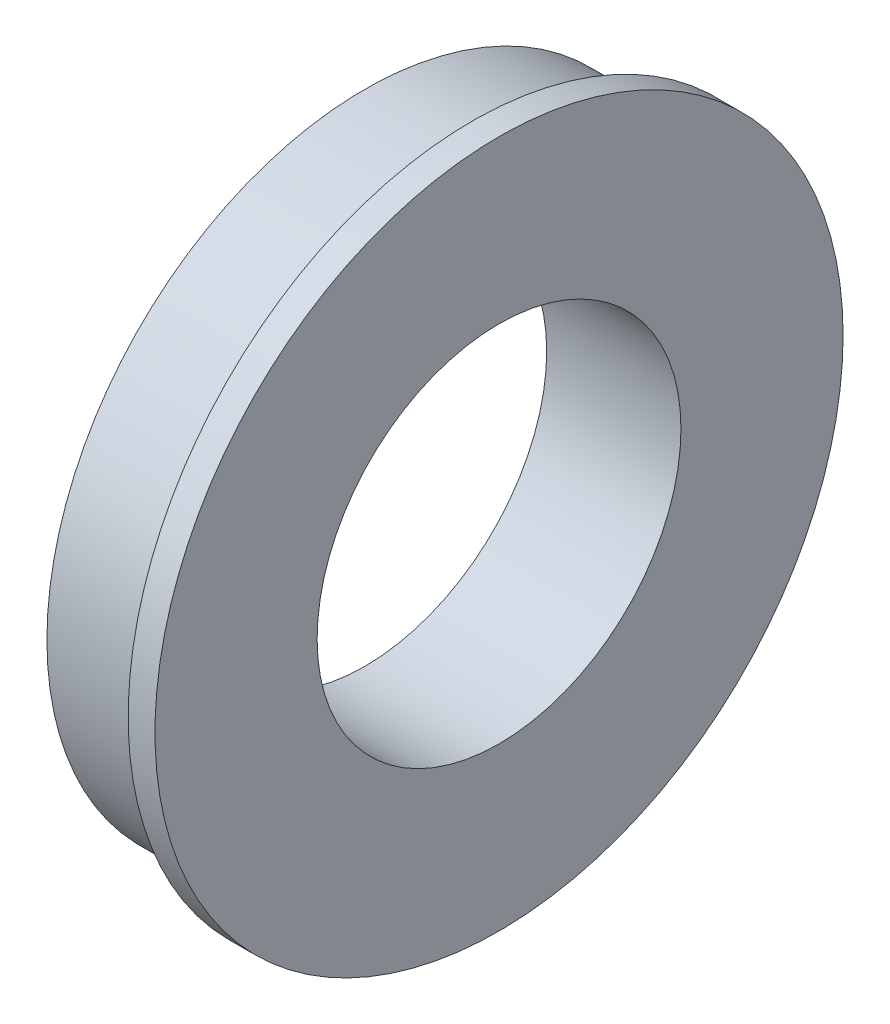
ISO-10303-21;
HEADER;
FILE_DESCRIPTION(('STEP AP214'),'2;1');
FILE_NAME('part.step','',(''),(''),'','','');
FILE_SCHEMA(('AUTOMOTIVE_DESIGN { 1 0 10303 214 1 1 1 1 }'));
ENDSEC;
DATA;
#1=APPLICATION_CONTEXT('core data for automotive mechanical design processes');
#2=APPLICATION_PROTOCOL_DEFINITION('international standard','automotive_design',2000,#1);
#3=PRODUCT_CONTEXT('',#1,'mechanical');
#4=PRODUCT('Part','Part','',(#3));
#5=PRODUCT_RELATED_PRODUCT_CATEGORY('part','',(#4));
#6=PRODUCT_DEFINITION_FORMATION('','',#4);
#7=PRODUCT_DEFINITION_CONTEXT('part definition',#1,'design');
#8=PRODUCT_DEFINITION('design','',#6,#7);
#9=PRODUCT_DEFINITION_SHAPE('','',#8);
#10=(LENGTH_UNIT() NAMED_UNIT(*) SI_UNIT(.MILLI.,.METRE.));
#11=(NAMED_UNIT(*) PLANE_ANGLE_UNIT() SI_UNIT($,.RADIAN.));
#12=(NAMED_UNIT(*) SI_UNIT($,.STERADIAN.) SOLID_ANGLE_UNIT());
#13=UNCERTAINTY_MEASURE_WITH_UNIT(LENGTH_MEASURE(1.E-05),#10,'distance_accuracy_value','');
#14=(GEOMETRIC_REPRESENTATION_CONTEXT(3) GLOBAL_UNCERTAINTY_ASSIGNED_CONTEXT((#13)) GLOBAL_UNIT_ASSIGNED_CONTEXT((#10,
#11,#12)) REPRESENTATION_CONTEXT('',''));
#15=CARTESIAN_POINT('',(0.,0.,0.));
#16=DIRECTION('',(0.,0.,1.));
#17=DIRECTION('',(1.,0.,0.));
#18=AXIS2_PLACEMENT_3D('',#15,#16,#17);
#19=CARTESIAN_POINT('',(0.,0.,0.));
#20=DIRECTION('',(1.,0.,0.));
#21=DIRECTION('',(0.,0.,-1.));
#22=AXIS2_PLACEMENT_3D('',#19,#20,#21);
#23=PLANE('',#22);
#24=CARTESIAN_POINT('',(0.,0.,0.));
#25=DIRECTION('',(1.,0.,0.));
#26=DIRECTION('',(0.,0.,-1.));
#27=AXIS2_PLACEMENT_3D('',#24,#25,#26);
#28=CIRCLE('',#27,47.35);
#29=CARTESIAN_POINT('',(0.,0.,-47.35));
#30=VERTEX_POINT('',#29);
#31=EDGE_CURVE('E36',#30,#30,#28,.T.);
#32=ORIENTED_EDGE('',*,*,#31,.F.);
#33=EDGE_LOOP('',(#32));
#34=FACE_BOUND('',#33,.T.);
#35=CARTESIAN_POINT('',(0.,0.,0.));
#36=DIRECTION('',(1.,0.,0.));
#37=DIRECTION('',(0.,0.,-1.));
#38=AXIS2_PLACEMENT_3D('',#35,#36,#37);
#39=CIRCLE('',#38,27.1);
#40=CARTESIAN_POINT('',(0.,0.,-27.1));
#41=VERTEX_POINT('',#40);
#42=EDGE_CURVE('E43',#41,#41,#39,.T.);
#43=ORIENTED_EDGE('',*,*,#42,.T.);
#44=EDGE_LOOP('',(#43));
#45=FACE_BOUND('',#44,.T.);
#46=ADVANCED_FACE('F32',(#34,#45),#23,.F.);
#47=CARTESIAN_POINT('',(16.,0.,0.));
#48=DIRECTION('',(-1.,0.,0.));
#49=DIRECTION('',(0.,0.,1.));
#50=AXIS2_PLACEMENT_3D('',#47,#48,#49);
#51=CYLINDRICAL_SURFACE('',#50,47.35);
#52=CARTESIAN_POINT('',(16.,0.,0.));
#53=DIRECTION('',(1.,0.,0.));
#54=DIRECTION('',(0.,0.,-1.));
#55=AXIS2_PLACEMENT_3D('',#52,#53,#54);
#56=CIRCLE('',#55,47.35);
#57=CARTESIAN_POINT('',(16.,0.,-47.35));
#58=VERTEX_POINT('',#57);
#59=EDGE_CURVE('E10',#58,#58,#56,.T.);
#60=ORIENTED_EDGE('',*,*,#59,.F.);
#61=EDGE_LOOP('',(#60));
#62=FACE_BOUND('',#61,.T.);
#63=ORIENTED_EDGE('',*,*,#31,.T.);
#64=EDGE_LOOP('',(#63));
#65=FACE_BOUND('',#64,.T.);
#66=ADVANCED_FACE('F34',(#62,#65),#51,.T.);
#67=CARTESIAN_POINT('',(16.,0.,0.));
#68=DIRECTION('',(-1.,0.,0.));
#69=DIRECTION('',(0.,0.,1.));
#70=AXIS2_PLACEMENT_3D('',#67,#68,#69);
#71=CYLINDRICAL_SURFACE('',#70,27.1);
#72=ORIENTED_EDGE('',*,*,#42,.F.);
#73=EDGE_LOOP('',(#72));
#74=FACE_BOUND('',#73,.T.);
#75=CARTESIAN_POINT('',(20.,0.,0.));
#76=DIRECTION('',(1.,0.,0.));
#77=DIRECTION('',(0.,0.,-1.));
#78=AXIS2_PLACEMENT_3D('',#75,#76,#77);
#79=CIRCLE('',#78,27.1);
#80=CARTESIAN_POINT('',(20.,0.,-27.1));
#81=VERTEX_POINT('',#80);
#82=EDGE_CURVE('E51',#81,#81,#79,.T.);
#83=ORIENTED_EDGE('',*,*,#82,.T.);
#84=EDGE_LOOP('',(#83));
#85=FACE_BOUND('',#84,.T.);
#86=ADVANCED_FACE('F57',(#74,#85),#71,.F.);
#87=CARTESIAN_POINT('',(16.,0.,0.));
#88=DIRECTION('',(1.,0.,0.));
#89=DIRECTION('',(0.,0.,-1.));
#90=AXIS2_PLACEMENT_3D('',#87,#88,#89);
#91=PLANE('',#90);
#92=CARTESIAN_POINT('',(16.,0.,0.));
#93=DIRECTION('',(1.,0.,0.));
#94=DIRECTION('',(0.,0.,-1.));
#95=AXIS2_PLACEMENT_3D('',#92,#93,#94);
#96=CIRCLE('',#95,51.25);
#97=CARTESIAN_POINT('',(16.,0.,-51.25));
#98=VERTEX_POINT('',#97);
#99=EDGE_CURVE('E48',#98,#98,#96,.T.);
#100=ORIENTED_EDGE('',*,*,#99,.F.);
#101=EDGE_LOOP('',(#100));
#102=FACE_BOUND('',#101,.T.);
#103=ORIENTED_EDGE('',*,*,#59,.T.);
#104=EDGE_LOOP('',(#103));
#105=FACE_BOUND('',#104,.T.);
#106=ADVANCED_FACE('F62',(#102,#105),#91,.F.);
#107=CARTESIAN_POINT('',(20.,0.,0.));
#108=DIRECTION('',(1.,0.,0.));
#109=DIRECTION('',(0.,0.,-1.));
#110=AXIS2_PLACEMENT_3D('',#107,#108,#109);
#111=PLANE('',#110);
#112=CARTESIAN_POINT('',(20.,0.,0.));
#113=DIRECTION('',(1.,0.,0.));
#114=DIRECTION('',(0.,0.,-1.));
#115=AXIS2_PLACEMENT_3D('',#112,#113,#114);
#116=CIRCLE('',#115,51.25);
#117=CARTESIAN_POINT('',(20.,0.,-51.25));
#118=VERTEX_POINT('',#117);
#119=EDGE_CURVE('E47',#118,#118,#116,.T.);
#120=ORIENTED_EDGE('',*,*,#119,.T.);
#121=EDGE_LOOP('',(#120));
#122=FACE_BOUND('',#121,.T.);
#123=ORIENTED_EDGE('',*,*,#82,.F.);
#124=EDGE_LOOP('',(#123));
#125=FACE_BOUND('',#124,.T.);
#126=ADVANCED_FACE('F59',(#122,#125),#111,.T.);
#127=CARTESIAN_POINT('',(20.,0.,0.));
#128=DIRECTION('',(-1.,0.,0.));
#129=DIRECTION('',(0.,0.,1.));
#130=AXIS2_PLACEMENT_3D('',#127,#128,#129);
#131=CYLINDRICAL_SURFACE('',#130,51.25);
#132=ORIENTED_EDGE('',*,*,#119,.F.);
#133=EDGE_LOOP('',(#132));
#134=FACE_BOUND('',#133,.T.);
#135=ORIENTED_EDGE('',*,*,#99,.T.);
#136=EDGE_LOOP('',(#135));
#137=FACE_BOUND('',#136,.T.);
#138=ADVANCED_FACE('F61',(#134,#137),#131,.T.);
#139=CLOSED_SHELL('',(#46,#66,#86,#106,#126,#138));
#140=MANIFOLD_SOLID_BREP('B2',#139);
#141=ADVANCED_BREP_SHAPE_REPRESENTATION('',(#18,#140),#14);
#142=SHAPE_DEFINITION_REPRESENTATION(#9,#141);
ENDSEC;
END-ISO-10303-21;
